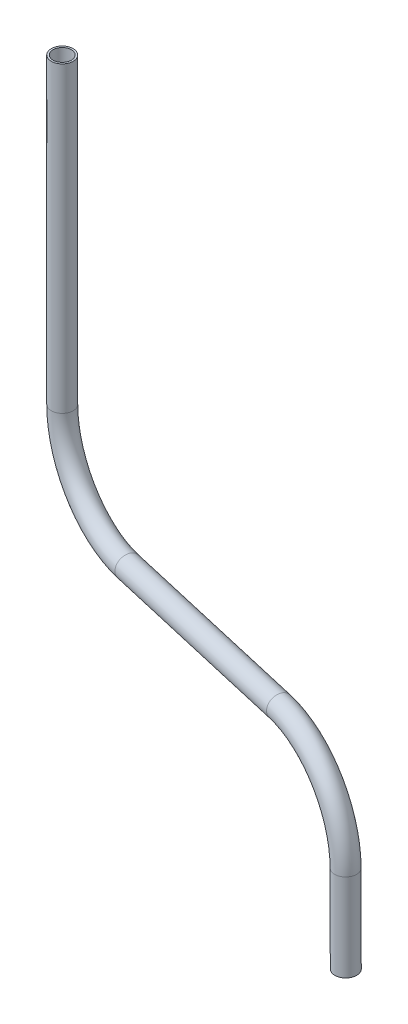
ISO-10303-21;
HEADER;
FILE_DESCRIPTION(('STEP AP214'),'2;1');
FILE_NAME('part.step','',(''),(''),'','','');
FILE_SCHEMA(('AUTOMOTIVE_DESIGN { 1 0 10303 214 1 1 1 1 }'));
ENDSEC;
DATA;
#1=APPLICATION_CONTEXT('core data for automotive mechanical design processes');
#2=APPLICATION_PROTOCOL_DEFINITION('international standard','automotive_design',2000,#1);
#3=PRODUCT_CONTEXT('',#1,'mechanical');
#4=PRODUCT('Part','Part','',(#3));
#5=PRODUCT_RELATED_PRODUCT_CATEGORY('part','',(#4));
#6=PRODUCT_DEFINITION_FORMATION('','',#4);
#7=PRODUCT_DEFINITION_CONTEXT('part definition',#1,'design');
#8=PRODUCT_DEFINITION('design','',#6,#7);
#9=PRODUCT_DEFINITION_SHAPE('','',#8);
#10=(LENGTH_UNIT() NAMED_UNIT(*) SI_UNIT(.MILLI.,.METRE.));
#11=(NAMED_UNIT(*) PLANE_ANGLE_UNIT() SI_UNIT($,.RADIAN.));
#12=(NAMED_UNIT(*) SI_UNIT($,.STERADIAN.) SOLID_ANGLE_UNIT());
#13=UNCERTAINTY_MEASURE_WITH_UNIT(LENGTH_MEASURE(1.E-05),#10,'distance_accuracy_value','');
#14=(GEOMETRIC_REPRESENTATION_CONTEXT(3) GLOBAL_UNCERTAINTY_ASSIGNED_CONTEXT((#13)) GLOBAL_UNIT_ASSIGNED_CONTEXT((#10,
#11,#12)) REPRESENTATION_CONTEXT('',''));
#15=CARTESIAN_POINT('',(0.,0.,0.));
#16=DIRECTION('',(0.,0.,1.));
#17=DIRECTION('',(1.,0.,0.));
#18=AXIS2_PLACEMENT_3D('',#15,#16,#17);
#19=CARTESIAN_POINT('',(-440.41650413962,543.990582934753,431.799999999987));
#20=DIRECTION('',(0.,1.,0.));
#21=DIRECTION('',(0.,0.,1.));
#22=AXIS2_PLACEMENT_3D('',#19,#20,#21);
#23=CYLINDRICAL_SURFACE('',#22,5.28319999999999);
#24=CARTESIAN_POINT('',(-440.41650413962,719.319181201379,431.799999999987));
#25=DIRECTION('',(0.,-1.,0.));
#26=DIRECTION('',(0.,0.,-1.));
#27=AXIS2_PLACEMENT_3D('',#24,#25,#26);
#28=CIRCLE('',#27,5.28319999999999);
#29=CARTESIAN_POINT('',(-440.41650413962,719.319181201379,426.516799999987));
#30=VERTEX_POINT('',#29);
#31=EDGE_CURVE('E45',#30,#30,#28,.T.);
#32=ORIENTED_EDGE('',*,*,#31,.F.);
#33=EDGE_LOOP('',(#32));
#34=FACE_BOUND('',#33,.T.);
#35=CARTESIAN_POINT('',(-440.41650413962,543.990582934753,431.799999999987));
#36=DIRECTION('',(0.,1.,0.));
#37=DIRECTION('',(0.,0.,1.));
#38=AXIS2_PLACEMENT_3D('',#35,#36,#37);
#39=CIRCLE('',#38,5.28319999999999);
#40=CARTESIAN_POINT('',(-445.565362098738,543.990582934753,430.616165570334));
#41=VERTEX_POINT('',#40);
#42=EDGE_CURVE('E56',#41,#41,#39,.T.);
#43=ORIENTED_EDGE('',*,*,#42,.F.);
#44=EDGE_LOOP('',(#43));
#45=FACE_BOUND('',#44,.T.);
#46=ADVANCED_FACE('F38',(#34,#45),#23,.F.);
#47=CARTESIAN_POINT('',(-440.41650413962,543.990582934753,431.799999999987));
#48=DIRECTION('',(0.,1.,0.));
#49=DIRECTION('',(0.,0.,1.));
#50=AXIS2_PLACEMENT_3D('',#47,#48,#49);
#51=CYLINDRICAL_SURFACE('',#50,6.34999999999999);
#52=CARTESIAN_POINT('',(-440.41650413962,719.319181201379,431.799999999987));
#53=DIRECTION('',(0.,-1.,0.));
#54=DIRECTION('',(0.,0.,-1.));
#55=AXIS2_PLACEMENT_3D('',#52,#53,#54);
#56=CIRCLE('',#55,6.34999999999999);
#57=CARTESIAN_POINT('',(-440.41650413962,719.319181201379,425.449999999987));
#58=VERTEX_POINT('',#57);
#59=EDGE_CURVE('E49',#58,#58,#56,.T.);
#60=ORIENTED_EDGE('',*,*,#59,.T.);
#61=EDGE_LOOP('',(#60));
#62=FACE_BOUND('',#61,.T.);
#63=CARTESIAN_POINT('',(-440.41650413962,543.990582934753,431.799999999987));
#64=DIRECTION('',(0.,-1.,0.));
#65=DIRECTION('',(0.,0.,-1.));
#66=AXIS2_PLACEMENT_3D('',#63,#64,#65);
#67=CIRCLE('',#66,6.34999999999999);
#68=CARTESIAN_POINT('',(-446.605035340483,543.990582934753,430.377122079731));
#69=VERTEX_POINT('',#68);
#70=EDGE_CURVE('E11',#69,#69,#67,.T.);
#71=ORIENTED_EDGE('',*,*,#70,.F.);
#72=EDGE_LOOP('',(#71));
#73=FACE_BOUND('',#72,.T.);
#74=ADVANCED_FACE('F40',(#62,#73),#51,.T.);
#75=CARTESIAN_POINT('',(-440.41650413962,719.319181201379,431.799999999987));
#76=DIRECTION('',(0.,-1.,0.));
#77=DIRECTION('',(0.,0.,-1.));
#78=AXIS2_PLACEMENT_3D('',#75,#76,#77);
#79=PLANE('',#78);
#80=ORIENTED_EDGE('',*,*,#31,.T.);
#81=EDGE_LOOP('',(#80));
#82=FACE_BOUND('',#81,.T.);
#83=ORIENTED_EDGE('',*,*,#59,.F.);
#84=EDGE_LOOP('',(#83));
#85=FACE_BOUND('',#84,.T.);
#86=ADVANCED_FACE('F116',(#82,#85),#79,.F.);
#87=CARTESIAN_POINT('',(-390.90825453272,543.990582934753,443.183023362032));
#88=DIRECTION('',(0.224075263032386,0.,-0.974571842655516));
#89=DIRECTION('',(-0.974571842655516,0.,-0.224075263032386));
#90=AXIS2_PLACEMENT_3D('',#87,#88,#89);
#91=TOROIDAL_SURFACE('',#90,50.8000000000001,5.28319999999999);
#92=CARTESIAN_POINT('',(-390.90825453272,493.190582934753,443.183023362032));
#93=DIRECTION('',(-0.974571842655516,0.,-0.224075263032386));
#94=DIRECTION('',(-0.224075263032386,0.,0.974571842655516));
#95=AXIS2_PLACEMENT_3D('',#92,#93,#94);
#96=CIRCLE('',#95,5.28319999999999);
#97=CARTESIAN_POINT('',(-390.90825453272,487.907382934753,443.183023362032));
#98=VERTEX_POINT('',#97);
#99=EDGE_CURVE('E62',#98,#98,#96,.T.);
#100=CARTESIAN_POINT('',(-390.90825453272,543.990582934753,443.183023362032));
#101=DIRECTION('',(0.224075263032386,0.,-0.974571842655516));
#102=DIRECTION('',(-0.974571842655516,0.,-0.224075263032386));
#103=AXIS2_PLACEMENT_3D('',#100,#101,#102);
#104=CIRCLE('',#103,56.0832000000001);
#105=EDGE_CURVE('',#98,#41,#104,.T.);
#106=ORIENTED_EDGE('',*,*,#99,.F.);
#107=ORIENTED_EDGE('',*,*,#42,.T.);
#108=ORIENTED_EDGE('',*,*,#105,.T.);
#109=ORIENTED_EDGE('',*,*,#105,.F.);
#110=EDGE_LOOP('',(#106,#108,#107,#109));
#111=FACE_BOUND('',#110,.T.);
#112=ADVANCED_FACE('F108',(#111),#91,.F.);
#113=CARTESIAN_POINT('',(-390.90825453272,543.990582934753,443.183023362032));
#114=DIRECTION('',(0.224075263032386,0.,-0.974571842655516));
#115=DIRECTION('',(-0.974571842655516,0.,-0.224075263032386));
#116=AXIS2_PLACEMENT_3D('',#113,#114,#115);
#117=TOROIDAL_SURFACE('',#116,50.8000000000001,6.34999999999999);
#118=CARTESIAN_POINT('',(-390.90825453272,493.190582934753,443.183023362032));
#119=DIRECTION('',(0.974571842655516,0.,0.224075263032386));
#120=DIRECTION('',(0.224075263032386,0.,-0.974571842655516));
#121=AXIS2_PLACEMENT_3D('',#118,#119,#120);
#122=CIRCLE('',#121,6.34999999999999);
#123=CARTESIAN_POINT('',(-390.90825453272,486.840582934753,443.183023362032));
#124=VERTEX_POINT('',#123);
#125=EDGE_CURVE('E53',#124,#124,#122,.T.);
#126=CARTESIAN_POINT('',(-390.90825453272,543.990582934753,443.183023362032));
#127=DIRECTION('',(0.224075263032386,0.,-0.974571842655516));
#128=DIRECTION('',(-0.974571842655516,0.,-0.224075263032386));
#129=AXIS2_PLACEMENT_3D('',#126,#127,#128);
#130=CIRCLE('',#129,57.1500000000001);
#131=EDGE_CURVE('',#124,#69,#130,.T.);
#132=ORIENTED_EDGE('',*,*,#125,.F.);
#133=ORIENTED_EDGE('',*,*,#70,.T.);
#134=ORIENTED_EDGE('',*,*,#131,.T.);
#135=ORIENTED_EDGE('',*,*,#131,.F.);
#136=EDGE_LOOP('',(#132,#134,#133,#135));
#137=FACE_BOUND('',#136,.T.);
#138=ADVANCED_FACE('F106',(#137),#117,.T.);
#139=CARTESIAN_POINT('',(-276.90074675213,493.190582934753,469.395829001885));
#140=DIRECTION('',(-0.974571842655515,0.,-0.224075263032387));
#141=DIRECTION('',(-0.224075263032387,0.,0.974571842655516));
#142=AXIS2_PLACEMENT_3D('',#139,#140,#141);
#143=CYLINDRICAL_SURFACE('',#142,5.28319999999999);
#144=CARTESIAN_POINT('',(-276.90074675213,493.190582934753,469.395829001885));
#145=DIRECTION('',(-0.974571842655516,0.,-0.224075263032386));
#146=DIRECTION('',(-0.224075263032386,0.,0.974571842655516));
#147=AXIS2_PLACEMENT_3D('',#144,#145,#146);
#148=CIRCLE('',#147,5.28319999999999);
#149=CARTESIAN_POINT('',(-276.902643380013,498.473776154441,469.404078016549));
#150=VERTEX_POINT('',#149);
#151=EDGE_CURVE('E68',#150,#150,#148,.T.);
#152=ORIENTED_EDGE('',*,*,#151,.F.);
#153=EDGE_LOOP('',(#152));
#154=FACE_BOUND('',#153,.T.);
#155=ORIENTED_EDGE('',*,*,#99,.T.);
#156=EDGE_LOOP('',(#155));
#157=FACE_BOUND('',#156,.T.);
#158=ADVANCED_FACE('F102',(#154,#157),#143,.F.);
#159=CARTESIAN_POINT('',(-276.90074675213,493.190582934753,469.395829001885));
#160=DIRECTION('',(-0.974571842655515,0.,-0.224075263032387));
#161=DIRECTION('',(-0.224075263032387,0.,0.974571842655516));
#162=AXIS2_PLACEMENT_3D('',#159,#160,#161);
#163=CYLINDRICAL_SURFACE('',#162,6.34999999999999);
#164=CARTESIAN_POINT('',(-276.90074675213,493.190582934753,469.395829001885));
#165=DIRECTION('',(0.974571842655516,0.,0.224075263032386));
#166=DIRECTION('',(0.224075263032386,0.,-0.974571842655516));
#167=AXIS2_PLACEMENT_3D('',#164,#165,#166);
#168=CIRCLE('',#167,6.34999999999999);
#169=CARTESIAN_POINT('',(-276.903026352951,499.54057478534,469.405743682971));
#170=VERTEX_POINT('',#169);
#171=EDGE_CURVE('E59',#170,#170,#168,.T.);
#172=ORIENTED_EDGE('',*,*,#171,.F.);
#173=EDGE_LOOP('',(#172));
#174=FACE_BOUND('',#173,.T.);
#175=ORIENTED_EDGE('',*,*,#125,.T.);
#176=EDGE_LOOP('',(#175));
#177=FACE_BOUND('',#176,.T.);
#178=ADVANCED_FACE('F99',(#174,#177),#163,.T.);
#179=CARTESIAN_POINT('',(-276.882509945566,442.390648130059,469.316511553197));
#180=DIRECTION('',(-0.224074975460434,-0.00160210569586735,0.97457059191715));
#181=DIRECTION('',(0.974571842655515,0.,0.224075263032387));
#182=AXIS2_PLACEMENT_3D('',#179,#180,#181);
#183=TOROIDAL_SURFACE('',#182,50.7999999999999,5.28319999999999);
#184=CARTESIAN_POINT('',(-227.374260338666,442.390648130059,480.699534915242));
#185=DIRECTION('',(-0.000358992255208391,0.999998716627846,0.00156136710015156));
#186=DIRECTION('',(0.,-0.0015613672007625,0.999998781065489));
#187=AXIS2_PLACEMENT_3D('',#184,#185,#186);
#188=CIRCLE('',#187,5.28319999999999);
#189=CARTESIAN_POINT('',(-222.225402379548,442.390648130059,481.883369344895));
#190=VERTEX_POINT('',#189);
#191=EDGE_CURVE('E74',#190,#190,#188,.T.);
#192=CARTESIAN_POINT('',(-276.882509945566,442.390648130059,469.316511553197));
#193=DIRECTION('',(-0.224074975460434,-0.00160210569586735,0.97457059191715));
#194=DIRECTION('',(0.974571842655515,0.,0.224075263032387));
#195=AXIS2_PLACEMENT_3D('',#192,#193,#194);
#196=CIRCLE('',#195,56.0831999999999);
#197=EDGE_CURVE('',#190,#150,#196,.T.);
#198=ORIENTED_EDGE('',*,*,#191,.F.);
#199=ORIENTED_EDGE('',*,*,#151,.T.);
#200=ORIENTED_EDGE('',*,*,#197,.T.);
#201=ORIENTED_EDGE('',*,*,#197,.F.);
#202=EDGE_LOOP('',(#198,#200,#199,#201));
#203=FACE_BOUND('',#202,.T.);
#204=ADVANCED_FACE('F95',(#203),#183,.F.);
#205=CARTESIAN_POINT('',(-276.882509945566,442.390648130059,469.316511553197));
#206=DIRECTION('',(-0.224074975460434,-0.00160210569586735,0.97457059191715));
#207=DIRECTION('',(0.974571842655515,0.,0.224075263032387));
#208=AXIS2_PLACEMENT_3D('',#205,#206,#207);
#209=TOROIDAL_SURFACE('',#208,50.7999999999999,6.34999999999999);
#210=CARTESIAN_POINT('',(-227.374260338666,442.390648130059,480.699534915243));
#211=DIRECTION('',(0.000358992255208218,-0.999998716627846,-0.0015613671001509));
#212=DIRECTION('',(0.,0.00156136720076184,-0.999998781065489));
#213=AXIS2_PLACEMENT_3D('',#210,#211,#212);
#214=CIRCLE('',#213,6.34999999999999);
#215=CARTESIAN_POINT('',(-221.185729137803,442.390648130059,482.122412835498));
#216=VERTEX_POINT('',#215);
#217=EDGE_CURVE('E65',#216,#216,#214,.T.);
#218=CARTESIAN_POINT('',(-276.882509945566,442.390648130059,469.316511553197));
#219=DIRECTION('',(-0.224074975460434,-0.00160210569586735,0.97457059191715));
#220=DIRECTION('',(0.974571842655515,0.,0.224075263032387));
#221=AXIS2_PLACEMENT_3D('',#218,#219,#220);
#222=CIRCLE('',#221,57.1499999999999);
#223=EDGE_CURVE('',#216,#170,#222,.T.);
#224=ORIENTED_EDGE('',*,*,#217,.F.);
#225=ORIENTED_EDGE('',*,*,#171,.T.);
#226=ORIENTED_EDGE('',*,*,#223,.T.);
#227=ORIENTED_EDGE('',*,*,#223,.F.);
#228=EDGE_LOOP('',(#224,#226,#225,#227));
#229=FACE_BOUND('',#228,.T.);
#230=ADVANCED_FACE('F92',(#229),#209,.T.);
#231=CARTESIAN_POINT('',(-227.356060491349,391.693665964434,480.620378213625));
#232=DIRECTION('',(-0.000358992255207292,0.999998716627846,0.00156136710015079));
#233=DIRECTION('',(0.,-0.00156136720076174,0.999998781065489));
#234=AXIS2_PLACEMENT_3D('',#231,#232,#233);
#235=CYLINDRICAL_SURFACE('',#234,5.28319999999999);
#236=CARTESIAN_POINT('',(-227.356060491349,391.693665964434,480.620378213625));
#237=DIRECTION('',(0.000358992255208391,-0.999998716627846,-0.00156136710015156));
#238=DIRECTION('',(-0.00160238585179889,0.00156078995279966,-0.999997498144023));
#239=AXIS2_PLACEMENT_3D('',#236,#237,#238);
#240=CIRCLE('',#239,5.28319999999999);
#241=CARTESIAN_POINT('',(-227.364526216281,391.701911929913,475.33719143143));
#242=VERTEX_POINT('',#241);
#243=EDGE_CURVE('E77',#242,#242,#240,.T.);
#244=ORIENTED_EDGE('',*,*,#243,.T.);
#245=EDGE_LOOP('',(#244));
#246=FACE_BOUND('',#245,.T.);
#247=ORIENTED_EDGE('',*,*,#191,.T.);
#248=EDGE_LOOP('',(#247));
#249=FACE_BOUND('',#248,.T.);
#250=ADVANCED_FACE('F88',(#246,#249),#235,.F.);
#251=CARTESIAN_POINT('',(-227.356060491349,391.693665964434,480.620378213625));
#252=DIRECTION('',(-0.000358992255207292,0.999998716627846,0.00156136710015079));
#253=DIRECTION('',(0.,-0.00156136720076174,0.999998781065489));
#254=AXIS2_PLACEMENT_3D('',#251,#252,#253);
#255=CYLINDRICAL_SURFACE('',#254,6.34999999999999);
#256=CARTESIAN_POINT('',(-227.356060491349,391.693665964434,480.620378213625));
#257=DIRECTION('',(0.000358992255208391,-0.999998716627846,-0.00156136710015156));
#258=DIRECTION('',(-0.00160238585179889,0.00156078995279966,-0.999997498144023));
#259=AXIS2_PLACEMENT_3D('',#256,#257,#258);
#260=CIRCLE('',#259,6.34999999999999);
#261=CARTESIAN_POINT('',(-227.366235641508,391.703576980635,474.27039410041));
#262=VERTEX_POINT('',#261);
#263=EDGE_CURVE('E71',#262,#262,#260,.T.);
#264=ORIENTED_EDGE('',*,*,#263,.F.);
#265=EDGE_LOOP('',(#264));
#266=FACE_BOUND('',#265,.T.);
#267=ORIENTED_EDGE('',*,*,#217,.T.);
#268=EDGE_LOOP('',(#267));
#269=FACE_BOUND('',#268,.T.);
#270=ADVANCED_FACE('F85',(#266,#269),#255,.T.);
#271=CARTESIAN_POINT('',(-227.356060491349,391.693665964434,480.620378213625));
#272=DIRECTION('',(0.000358992255208391,-0.999998716627846,-0.00156136710015156));
#273=DIRECTION('',(-0.00160238585179889,0.00156078995279966,-0.999997498144023));
#274=AXIS2_PLACEMENT_3D('',#271,#272,#273);
#275=PLANE('',#274);
#276=ORIENTED_EDGE('',*,*,#243,.F.);
#277=EDGE_LOOP('',(#276));
#278=FACE_BOUND('',#277,.T.);
#279=ORIENTED_EDGE('',*,*,#263,.T.);
#280=EDGE_LOOP('',(#279));
#281=FACE_BOUND('',#280,.T.);
#282=ADVANCED_FACE('F83',(#278,#281),#275,.T.);
#283=CLOSED_SHELL('',(#46,#74,#86,#112,#138,#158,#178,#204,#230,#250,#270,#282));
#284=MANIFOLD_SOLID_BREP('B2',#283);
#285=ADVANCED_BREP_SHAPE_REPRESENTATION('',(#18,#284),#14);
#286=SHAPE_DEFINITION_REPRESENTATION(#9,#285);
ENDSEC;
END-ISO-10303-21;
